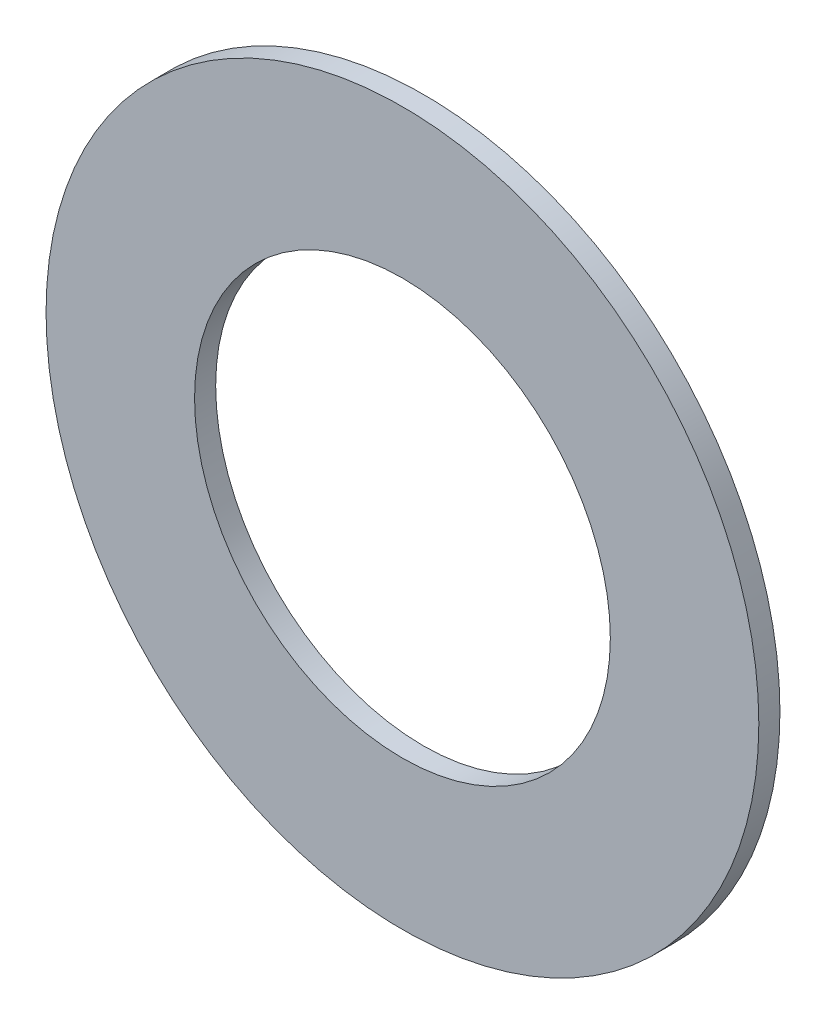
ISO-10303-21;
HEADER;
FILE_DESCRIPTION(('STEP AP214'),'2;1');
FILE_NAME('part.step','',(''),(''),'','','');
FILE_SCHEMA(('AUTOMOTIVE_DESIGN { 1 0 10303 214 1 1 1 1 }'));
ENDSEC;
DATA;
#1=APPLICATION_CONTEXT('core data for automotive mechanical design processes');
#2=APPLICATION_PROTOCOL_DEFINITION('international standard','automotive_design',2000,#1);
#3=PRODUCT_CONTEXT('',#1,'mechanical');
#4=PRODUCT('Part','Part','',(#3));
#5=PRODUCT_RELATED_PRODUCT_CATEGORY('part','',(#4));
#6=PRODUCT_DEFINITION_FORMATION('','',#4);
#7=PRODUCT_DEFINITION_CONTEXT('part definition',#1,'design');
#8=PRODUCT_DEFINITION('design','',#6,#7);
#9=PRODUCT_DEFINITION_SHAPE('','',#8);
#10=(LENGTH_UNIT() NAMED_UNIT(*) SI_UNIT(.MILLI.,.METRE.));
#11=(NAMED_UNIT(*) PLANE_ANGLE_UNIT() SI_UNIT($,.RADIAN.));
#12=(NAMED_UNIT(*) SI_UNIT($,.STERADIAN.) SOLID_ANGLE_UNIT());
#13=UNCERTAINTY_MEASURE_WITH_UNIT(LENGTH_MEASURE(1.E-05),#10,'distance_accuracy_value','');
#14=(GEOMETRIC_REPRESENTATION_CONTEXT(3) GLOBAL_UNCERTAINTY_ASSIGNED_CONTEXT((#13)) GLOBAL_UNIT_ASSIGNED_CONTEXT((#10,
#11,#12)) REPRESENTATION_CONTEXT('',''));
#15=CARTESIAN_POINT('',(0.,0.,0.));
#16=DIRECTION('',(0.,0.,1.));
#17=DIRECTION('',(1.,0.,0.));
#18=AXIS2_PLACEMENT_3D('',#15,#16,#17);
#19=CARTESIAN_POINT('',(0.,0.,0.));
#20=DIRECTION('',(0.,0.,-1.));
#21=DIRECTION('',(1.,0.,0.));
#22=AXIS2_PLACEMENT_3D('',#19,#20,#21);
#23=CYLINDRICAL_SURFACE('',#22,0.5999988);
#24=CARTESIAN_POINT('',(0.,0.,0.03556));
#25=DIRECTION('',(0.,0.,1.));
#26=DIRECTION('',(1.,0.,0.));
#27=AXIS2_PLACEMENT_3D('',#24,#25,#26);
#28=CIRCLE('',#27,0.5999988);
#29=CARTESIAN_POINT('',(0.5999988,0.,0.03556));
#30=VERTEX_POINT('',#29);
#31=EDGE_CURVE('E11',#30,#30,#28,.T.);
#32=ORIENTED_EDGE('',*,*,#31,.F.);
#33=DIRECTION('',(0.,0.,1.));
#34=VECTOR('',#33,1.);
#35=CARTESIAN_POINT('',(0.5999988,0.,0.));
#36=LINE('',#35,#34);
#37=CARTESIAN_POINT('',(0.5999988,0.,0.));
#38=VERTEX_POINT('',#37);
#39=EDGE_CURVE('E24',#38,#30,#36,.T.);
#40=ORIENTED_EDGE('',*,*,#39,.F.);
#41=CARTESIAN_POINT('',(0.,0.,0.));
#42=DIRECTION('',(0.,0.,1.));
#43=DIRECTION('',(1.,0.,0.));
#44=AXIS2_PLACEMENT_3D('',#41,#42,#43);
#45=CIRCLE('',#44,0.5999988);
#46=EDGE_CURVE('E46',#38,#38,#45,.T.);
#47=ORIENTED_EDGE('',*,*,#46,.T.);
#48=ORIENTED_EDGE('',*,*,#39,.T.);
#49=EDGE_LOOP('',(#32,#40,#47,#48));
#50=FACE_BOUND('',#49,.T.);
#51=ADVANCED_FACE('F17',(#50),#23,.T.);
#52=CARTESIAN_POINT('',(0.,0.,0.));
#53=DIRECTION('',(0.,0.,-1.));
#54=DIRECTION('',(1.,0.,0.));
#55=AXIS2_PLACEMENT_3D('',#52,#53,#54);
#56=CYLINDRICAL_SURFACE('',#55,0.3499993);
#57=DIRECTION('',(0.,0.,1.));
#58=VECTOR('',#57,1.);
#59=CARTESIAN_POINT('',(0.3499993,0.,0.));
#60=LINE('',#59,#58);
#61=CARTESIAN_POINT('',(0.3499993,0.,0.));
#62=VERTEX_POINT('',#61);
#63=CARTESIAN_POINT('',(0.3499993,0.,0.03556));
#64=VERTEX_POINT('',#63);
#65=EDGE_CURVE('E40',#62,#64,#60,.T.);
#66=ORIENTED_EDGE('',*,*,#65,.T.);
#67=CARTESIAN_POINT('',(0.,0.,0.03556));
#68=DIRECTION('',(0.,0.,1.));
#69=DIRECTION('',(1.,0.,0.));
#70=AXIS2_PLACEMENT_3D('',#67,#68,#69);
#71=CIRCLE('',#70,0.3499993);
#72=EDGE_CURVE('E45',#64,#64,#71,.T.);
#73=ORIENTED_EDGE('',*,*,#72,.T.);
#74=ORIENTED_EDGE('',*,*,#65,.F.);
#75=CARTESIAN_POINT('',(0.,0.,0.));
#76=DIRECTION('',(0.,0.,1.));
#77=DIRECTION('',(1.,0.,0.));
#78=AXIS2_PLACEMENT_3D('',#75,#76,#77);
#79=CIRCLE('',#78,0.3499993);
#80=EDGE_CURVE('E43',#62,#62,#79,.T.);
#81=ORIENTED_EDGE('',*,*,#80,.F.);
#82=EDGE_LOOP('',(#66,#73,#74,#81));
#83=FACE_BOUND('',#82,.T.);
#84=ADVANCED_FACE('F42',(#83),#56,.F.);
#85=CARTESIAN_POINT('',(0.5999988,0.,0.));
#86=DIRECTION('',(0.,0.,-1.));
#87=DIRECTION('',(-1.,0.,0.));
#88=AXIS2_PLACEMENT_3D('',#85,#86,#87);
#89=PLANE('',#88);
#90=ORIENTED_EDGE('',*,*,#46,.F.);
#91=EDGE_LOOP('',(#90));
#92=FACE_BOUND('',#91,.T.);
#93=ORIENTED_EDGE('',*,*,#80,.T.);
#94=EDGE_LOOP('',(#93));
#95=FACE_BOUND('',#94,.T.);
#96=ADVANCED_FACE('F49',(#92,#95),#89,.T.);
#97=CARTESIAN_POINT('',(0.5999988,0.,0.03556));
#98=DIRECTION('',(0.,0.,-1.));
#99=DIRECTION('',(-1.,0.,0.));
#100=AXIS2_PLACEMENT_3D('',#97,#98,#99);
#101=PLANE('',#100);
#102=ORIENTED_EDGE('',*,*,#31,.T.);
#103=EDGE_LOOP('',(#102));
#104=FACE_BOUND('',#103,.T.);
#105=ORIENTED_EDGE('',*,*,#72,.F.);
#106=EDGE_LOOP('',(#105));
#107=FACE_BOUND('',#106,.T.);
#108=ADVANCED_FACE('F56',(#104,#107),#101,.F.);
#109=CLOSED_SHELL('',(#51,#84,#96,#108));
#110=MANIFOLD_SOLID_BREP('B1',#109);
#111=ADVANCED_BREP_SHAPE_REPRESENTATION('',(#18,#110),#14);
#112=SHAPE_DEFINITION_REPRESENTATION(#9,#111);
ENDSEC;
END-ISO-10303-21;
